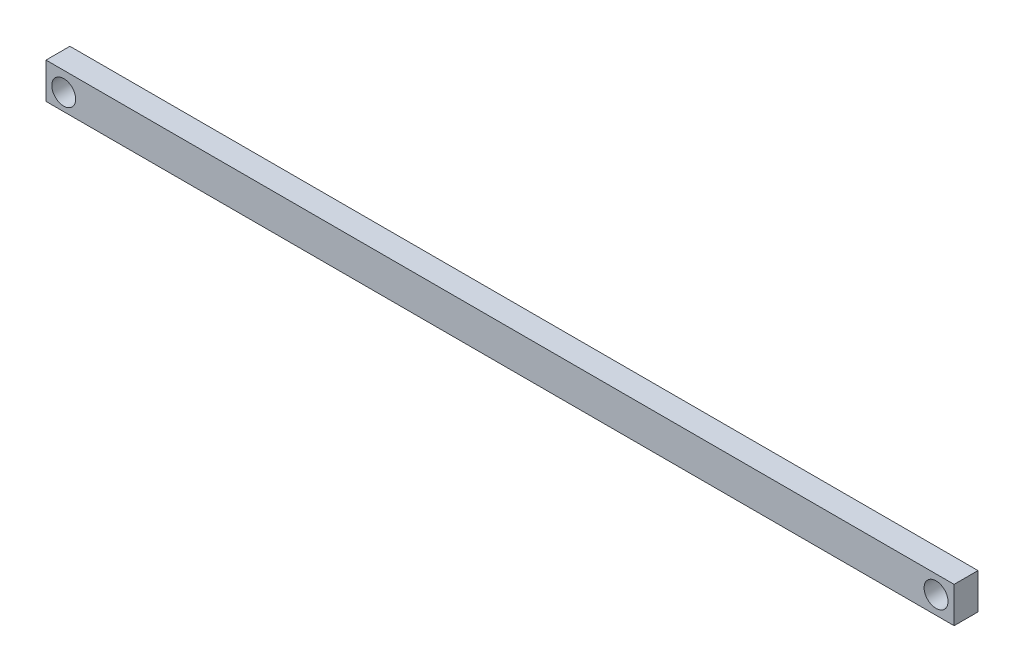
ISO-10303-21;
HEADER;
FILE_DESCRIPTION(('STEP AP214'),'2;1');
FILE_NAME('part.step','',(''),(''),'','','');
FILE_SCHEMA(('AUTOMOTIVE_DESIGN { 1 0 10303 214 1 1 1 1 }'));
ENDSEC;
DATA;
#1=APPLICATION_CONTEXT('core data for automotive mechanical design processes');
#2=APPLICATION_PROTOCOL_DEFINITION('international standard','automotive_design',2000,#1);
#3=PRODUCT_CONTEXT('',#1,'mechanical');
#4=PRODUCT('Part','Part','',(#3));
#5=PRODUCT_RELATED_PRODUCT_CATEGORY('part','',(#4));
#6=PRODUCT_DEFINITION_FORMATION('','',#4);
#7=PRODUCT_DEFINITION_CONTEXT('part definition',#1,'design');
#8=PRODUCT_DEFINITION('design','',#6,#7);
#9=PRODUCT_DEFINITION_SHAPE('','',#8);
#10=(LENGTH_UNIT() NAMED_UNIT(*) SI_UNIT(.MILLI.,.METRE.));
#11=(NAMED_UNIT(*) PLANE_ANGLE_UNIT() SI_UNIT($,.RADIAN.));
#12=(NAMED_UNIT(*) SI_UNIT($,.STERADIAN.) SOLID_ANGLE_UNIT());
#13=UNCERTAINTY_MEASURE_WITH_UNIT(LENGTH_MEASURE(1.E-05),#10,'distance_accuracy_value','');
#14=(GEOMETRIC_REPRESENTATION_CONTEXT(3) GLOBAL_UNCERTAINTY_ASSIGNED_CONTEXT((#13)) GLOBAL_UNIT_ASSIGNED_CONTEXT((#10,
#11,#12)) REPRESENTATION_CONTEXT('',''));
#15=CARTESIAN_POINT('',(0.,0.,0.));
#16=DIRECTION('',(0.,0.,1.));
#17=DIRECTION('',(1.,0.,0.));
#18=AXIS2_PLACEMENT_3D('',#15,#16,#17);
#19=CARTESIAN_POINT('',(-83.6232058194591,22.9433316592597,10.));
#20=DIRECTION('',(1.,0.,0.));
#21=DIRECTION('',(0.,0.,-1.));
#22=AXIS2_PLACEMENT_3D('',#19,#20,#21);
#23=PLANE('',#22);
#24=DIRECTION('',(0.,-1.,0.));
#25=VECTOR('',#24,1.);
#26=CARTESIAN_POINT('',(-83.6232058194591,22.9433316592597,0.));
#27=LINE('',#26,#25);
#28=CARTESIAN_POINT('',(-83.6232058194591,22.9433316592597,0.));
#29=VERTEX_POINT('',#28);
#30=CARTESIAN_POINT('',(-83.6232058194591,7.94333165925967,0.));
#31=VERTEX_POINT('',#30);
#32=EDGE_CURVE('E102',#29,#31,#27,.T.);
#33=ORIENTED_EDGE('',*,*,#32,.T.);
#34=DIRECTION('',(0.,0.,-1.));
#35=VECTOR('',#34,1.);
#36=CARTESIAN_POINT('',(-83.6232058194591,7.94333165925967,10.));
#37=LINE('',#36,#35);
#38=CARTESIAN_POINT('',(-83.6232058194591,7.94333165925967,10.));
#39=VERTEX_POINT('',#38);
#40=EDGE_CURVE('E11',#39,#31,#37,.T.);
#41=ORIENTED_EDGE('',*,*,#40,.F.);
#42=DIRECTION('',(0.,-1.,0.));
#43=VECTOR('',#42,1.);
#44=CARTESIAN_POINT('',(-83.6232058194591,22.9433316592597,10.));
#45=LINE('',#44,#43);
#46=CARTESIAN_POINT('',(-83.6232058194591,22.9433316592597,10.));
#47=VERTEX_POINT('',#46);
#48=EDGE_CURVE('E90',#47,#39,#45,.T.);
#49=ORIENTED_EDGE('',*,*,#48,.F.);
#50=DIRECTION('',(0.,0.,-1.));
#51=VECTOR('',#50,1.);
#52=CARTESIAN_POINT('',(-83.6232058194591,22.9433316592597,10.));
#53=LINE('',#52,#51);
#54=EDGE_CURVE('E98',#47,#29,#53,.T.);
#55=ORIENTED_EDGE('',*,*,#54,.T.);
#56=EDGE_LOOP('',(#33,#41,#49,#55));
#57=FACE_BOUND('',#56,.T.);
#58=ADVANCED_FACE('F39',(#57),#23,.F.);
#59=CARTESIAN_POINT('',(-83.6232058194591,7.94333165925967,10.));
#60=DIRECTION('',(0.,1.,0.));
#61=DIRECTION('',(0.,0.,1.));
#62=AXIS2_PLACEMENT_3D('',#59,#60,#61);
#63=PLANE('',#62);
#64=DIRECTION('',(1.,0.,0.));
#65=VECTOR('',#64,1.);
#66=CARTESIAN_POINT('',(-83.6232058194591,7.94333165925967,0.));
#67=LINE('',#66,#65);
#68=CARTESIAN_POINT('',(296.376794180541,7.94333165925967,0.));
#69=VERTEX_POINT('',#68);
#70=EDGE_CURVE('E94',#31,#69,#67,.T.);
#71=ORIENTED_EDGE('',*,*,#70,.T.);
#72=DIRECTION('',(0.,0.,-1.));
#73=VECTOR('',#72,1.);
#74=CARTESIAN_POINT('',(296.376794180541,7.94333165925967,10.));
#75=LINE('',#74,#73);
#76=CARTESIAN_POINT('',(296.376794180541,7.94333165925967,10.));
#77=VERTEX_POINT('',#76);
#78=EDGE_CURVE('E47',#77,#69,#75,.T.);
#79=ORIENTED_EDGE('',*,*,#78,.F.);
#80=DIRECTION('',(1.,0.,0.));
#81=VECTOR('',#80,1.);
#82=CARTESIAN_POINT('',(-83.6232058194591,7.94333165925967,10.));
#83=LINE('',#82,#81);
#84=EDGE_CURVE('E85',#39,#77,#83,.T.);
#85=ORIENTED_EDGE('',*,*,#84,.F.);
#86=ORIENTED_EDGE('',*,*,#40,.T.);
#87=EDGE_LOOP('',(#71,#79,#85,#86));
#88=FACE_BOUND('',#87,.T.);
#89=ADVANCED_FACE('F93',(#88),#63,.F.);
#90=CARTESIAN_POINT('',(296.376794180541,22.9433316592597,10.));
#91=DIRECTION('',(-1.,0.,0.));
#92=DIRECTION('',(0.,0.,1.));
#93=AXIS2_PLACEMENT_3D('',#90,#91,#92);
#94=PLANE('',#93);
#95=DIRECTION('',(0.,1.,0.));
#96=VECTOR('',#95,1.);
#97=CARTESIAN_POINT('',(296.376794180541,22.9433316592597,0.));
#98=LINE('',#97,#96);
#99=CARTESIAN_POINT('',(296.376794180541,22.9433316592597,0.));
#100=VERTEX_POINT('',#99);
#101=EDGE_CURVE('E72',#69,#100,#98,.T.);
#102=ORIENTED_EDGE('',*,*,#101,.T.);
#103=DIRECTION('',(0.,0.,-1.));
#104=VECTOR('',#103,1.);
#105=CARTESIAN_POINT('',(296.376794180541,22.9433316592597,10.));
#106=LINE('',#105,#104);
#107=CARTESIAN_POINT('',(296.376794180541,22.9433316592597,10.));
#108=VERTEX_POINT('',#107);
#109=EDGE_CURVE('E95',#108,#100,#106,.T.);
#110=ORIENTED_EDGE('',*,*,#109,.F.);
#111=DIRECTION('',(0.,1.,0.));
#112=VECTOR('',#111,1.);
#113=CARTESIAN_POINT('',(296.376794180541,22.9433316592597,10.));
#114=LINE('',#113,#112);
#115=EDGE_CURVE('E88',#77,#108,#114,.T.);
#116=ORIENTED_EDGE('',*,*,#115,.F.);
#117=ORIENTED_EDGE('',*,*,#78,.T.);
#118=EDGE_LOOP('',(#102,#110,#116,#117));
#119=FACE_BOUND('',#118,.T.);
#120=ADVANCED_FACE('F96',(#119),#94,.F.);
#121=CARTESIAN_POINT('',(-83.6232058194591,22.9433316592597,10.));
#122=DIRECTION('',(0.,-1.,0.));
#123=DIRECTION('',(0.,0.,-1.));
#124=AXIS2_PLACEMENT_3D('',#121,#122,#123);
#125=PLANE('',#124);
#126=DIRECTION('',(-1.,0.,0.));
#127=VECTOR('',#126,1.);
#128=CARTESIAN_POINT('',(-83.6232058194591,22.9433316592597,0.));
#129=LINE('',#128,#127);
#130=EDGE_CURVE('E78',#100,#29,#129,.T.);
#131=ORIENTED_EDGE('',*,*,#130,.T.);
#132=ORIENTED_EDGE('',*,*,#54,.F.);
#133=DIRECTION('',(-1.,0.,0.));
#134=VECTOR('',#133,1.);
#135=CARTESIAN_POINT('',(-83.6232058194591,22.9433316592597,10.));
#136=LINE('',#135,#134);
#137=EDGE_CURVE('E55',#108,#47,#136,.T.);
#138=ORIENTED_EDGE('',*,*,#137,.F.);
#139=ORIENTED_EDGE('',*,*,#109,.T.);
#140=EDGE_LOOP('',(#131,#132,#138,#139));
#141=FACE_BOUND('',#140,.T.);
#142=ADVANCED_FACE('F110',(#141),#125,.F.);
#143=CARTESIAN_POINT('',(0.,0.,10.));
#144=DIRECTION('',(0.,0.,1.));
#145=DIRECTION('',(1.,0.,0.));
#146=AXIS2_PLACEMENT_3D('',#143,#144,#145);
#147=PLANE('',#146);
#148=CARTESIAN_POINT('',(-76.1991699823503,14.9573493859353,10.));
#149=DIRECTION('',(0.,0.,1.));
#150=DIRECTION('',(1.,0.,0.));
#151=AXIS2_PLACEMENT_3D('',#148,#149,#150);
#152=CIRCLE('',#151,5.);
#153=CARTESIAN_POINT('',(-71.1991699823503,14.9573493859353,10.));
#154=VERTEX_POINT('',#153);
#155=EDGE_CURVE('E122',#154,#154,#152,.T.);
#156=ORIENTED_EDGE('',*,*,#155,.F.);
#157=EDGE_LOOP('',(#156));
#158=FACE_BOUND('',#157,.T.);
#159=CARTESIAN_POINT('',(288.824182165614,15.4433316592597,10.));
#160=DIRECTION('',(0.,0.,1.));
#161=DIRECTION('',(1.,0.,0.));
#162=AXIS2_PLACEMENT_3D('',#159,#160,#161);
#163=CIRCLE('',#162,4.99999999999999);
#164=CARTESIAN_POINT('',(293.824182165614,15.4433316592597,10.));
#165=VERTEX_POINT('',#164);
#166=EDGE_CURVE('E119',#165,#165,#163,.T.);
#167=ORIENTED_EDGE('',*,*,#166,.F.);
#168=EDGE_LOOP('',(#167));
#169=FACE_BOUND('',#168,.T.);
#170=ORIENTED_EDGE('',*,*,#48,.T.);
#171=ORIENTED_EDGE('',*,*,#84,.T.);
#172=ORIENTED_EDGE('',*,*,#115,.T.);
#173=ORIENTED_EDGE('',*,*,#137,.T.);
#174=EDGE_LOOP('',(#170,#171,#172,#173));
#175=FACE_BOUND('',#174,.T.);
#176=ADVANCED_FACE('F86',(#158,#169,#175),#147,.T.);
#177=CARTESIAN_POINT('',(0.,0.,0.));
#178=DIRECTION('',(0.,0.,1.));
#179=DIRECTION('',(1.,0.,0.));
#180=AXIS2_PLACEMENT_3D('',#177,#178,#179);
#181=PLANE('',#180);
#182=CARTESIAN_POINT('',(-76.1991699823503,14.9573493859353,0.));
#183=DIRECTION('',(0.,0.,1.));
#184=DIRECTION('',(1.,0.,0.));
#185=AXIS2_PLACEMENT_3D('',#182,#183,#184);
#186=CIRCLE('',#185,5.);
#187=CARTESIAN_POINT('',(-71.1991699823503,14.9573493859353,0.));
#188=VERTEX_POINT('',#187);
#189=EDGE_CURVE('E105',#188,#188,#186,.T.);
#190=ORIENTED_EDGE('',*,*,#189,.T.);
#191=EDGE_LOOP('',(#190));
#192=FACE_BOUND('',#191,.T.);
#193=CARTESIAN_POINT('',(288.824182165614,15.4433316592597,0.));
#194=DIRECTION('',(0.,0.,1.));
#195=DIRECTION('',(1.,0.,0.));
#196=AXIS2_PLACEMENT_3D('',#193,#194,#195);
#197=CIRCLE('',#196,4.99999999999999);
#198=CARTESIAN_POINT('',(293.824182165614,15.4433316592597,0.));
#199=VERTEX_POINT('',#198);
#200=EDGE_CURVE('E116',#199,#199,#197,.T.);
#201=ORIENTED_EDGE('',*,*,#200,.T.);
#202=EDGE_LOOP('',(#201));
#203=FACE_BOUND('',#202,.T.);
#204=ORIENTED_EDGE('',*,*,#32,.F.);
#205=ORIENTED_EDGE('',*,*,#130,.F.);
#206=ORIENTED_EDGE('',*,*,#101,.F.);
#207=ORIENTED_EDGE('',*,*,#70,.F.);
#208=EDGE_LOOP('',(#204,#205,#206,#207));
#209=FACE_BOUND('',#208,.T.);
#210=ADVANCED_FACE('F113',(#192,#203,#209),#181,.F.);
#211=CARTESIAN_POINT('',(288.824182165614,15.4433316592597,0.));
#212=DIRECTION('',(0.,0.,1.));
#213=DIRECTION('',(1.,0.,0.));
#214=AXIS2_PLACEMENT_3D('',#211,#212,#213);
#215=CYLINDRICAL_SURFACE('',#214,4.99999999999999);
#216=ORIENTED_EDGE('',*,*,#200,.F.);
#217=EDGE_LOOP('',(#216));
#218=FACE_BOUND('',#217,.T.);
#219=ORIENTED_EDGE('',*,*,#166,.T.);
#220=EDGE_LOOP('',(#219));
#221=FACE_BOUND('',#220,.T.);
#222=ADVANCED_FACE('F133',(#218,#221),#215,.F.);
#223=CARTESIAN_POINT('',(-76.1991699823503,14.9573493859353,0.));
#224=DIRECTION('',(0.,0.,1.));
#225=DIRECTION('',(1.,0.,0.));
#226=AXIS2_PLACEMENT_3D('',#223,#224,#225);
#227=CYLINDRICAL_SURFACE('',#226,5.);
#228=ORIENTED_EDGE('',*,*,#189,.F.);
#229=EDGE_LOOP('',(#228));
#230=FACE_BOUND('',#229,.T.);
#231=ORIENTED_EDGE('',*,*,#155,.T.);
#232=EDGE_LOOP('',(#231));
#233=FACE_BOUND('',#232,.T.);
#234=ADVANCED_FACE('F130',(#230,#233),#227,.F.);
#235=CLOSED_SHELL('',(#58,#89,#120,#142,#176,#210,#222,#234));
#236=MANIFOLD_SOLID_BREP('B2',#235);
#237=ADVANCED_BREP_SHAPE_REPRESENTATION('',(#18,#236),#14);
#238=SHAPE_DEFINITION_REPRESENTATION(#9,#237);
ENDSEC;
END-ISO-10303-21;
